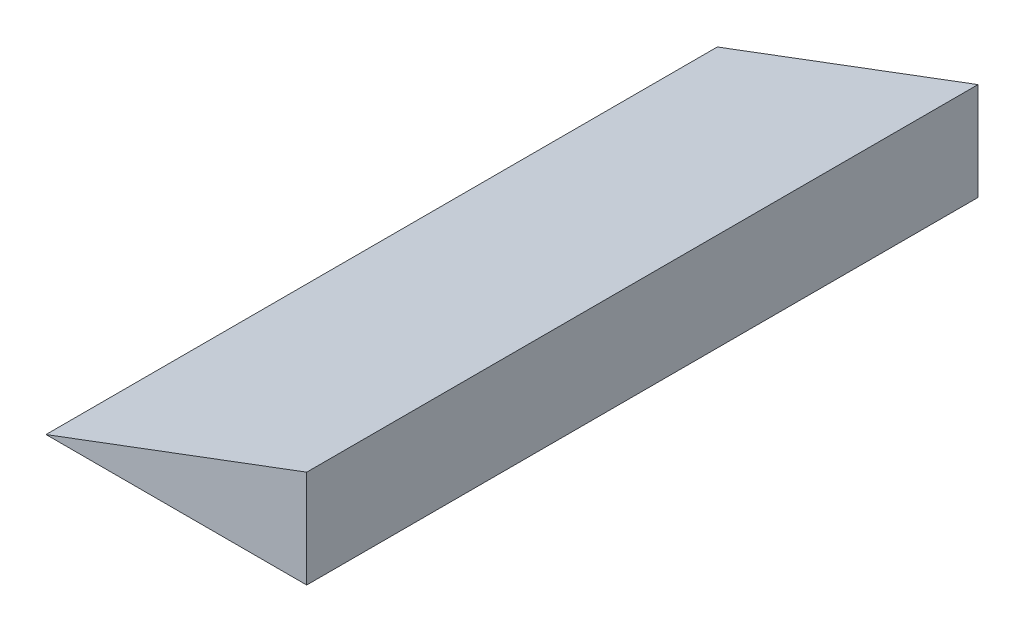
ISO-10303-21;
HEADER;
FILE_DESCRIPTION(('STEP AP214'),'2;1');
FILE_NAME('part.step','',(''),(''),'','','');
FILE_SCHEMA(('AUTOMOTIVE_DESIGN { 1 0 10303 214 1 1 1 1 }'));
ENDSEC;
DATA;
#1=APPLICATION_CONTEXT('core data for automotive mechanical design processes');
#2=APPLICATION_PROTOCOL_DEFINITION('international standard','automotive_design',2000,#1);
#3=PRODUCT_CONTEXT('',#1,'mechanical');
#4=PRODUCT('Part','Part','',(#3));
#5=PRODUCT_RELATED_PRODUCT_CATEGORY('part','',(#4));
#6=PRODUCT_DEFINITION_FORMATION('','',#4);
#7=PRODUCT_DEFINITION_CONTEXT('part definition',#1,'design');
#8=PRODUCT_DEFINITION('design','',#6,#7);
#9=PRODUCT_DEFINITION_SHAPE('','',#8);
#10=(LENGTH_UNIT() NAMED_UNIT(*) SI_UNIT(.MILLI.,.METRE.));
#11=(NAMED_UNIT(*) PLANE_ANGLE_UNIT() SI_UNIT($,.RADIAN.));
#12=(NAMED_UNIT(*) SI_UNIT($,.STERADIAN.) SOLID_ANGLE_UNIT());
#13=UNCERTAINTY_MEASURE_WITH_UNIT(LENGTH_MEASURE(1.E-05),#10,'distance_accuracy_value','');
#14=(GEOMETRIC_REPRESENTATION_CONTEXT(3) GLOBAL_UNCERTAINTY_ASSIGNED_CONTEXT((#13)) GLOBAL_UNIT_ASSIGNED_CONTEXT((#10,
#11,#12)) REPRESENTATION_CONTEXT('',''));
#15=CARTESIAN_POINT('',(0.,0.,0.));
#16=DIRECTION('',(0.,0.,1.));
#17=DIRECTION('',(1.,0.,0.));
#18=AXIS2_PLACEMENT_3D('',#15,#16,#17);
#19=CARTESIAN_POINT('',(12.,0.,103.));
#20=DIRECTION('',(-1.,0.,0.));
#21=DIRECTION('',(0.,-1.,0.));
#22=AXIS2_PLACEMENT_3D('',#19,#20,#21);
#23=PLANE('',#22);
#24=DIRECTION('',(0.,1.,0.));
#25=VECTOR('',#24,1.);
#26=CARTESIAN_POINT('',(12.,0.,0.));
#27=LINE('',#26,#25);
#28=CARTESIAN_POINT('',(12.,0.,0.));
#29=VERTEX_POINT('',#28);
#30=CARTESIAN_POINT('',(12.,15.,0.));
#31=VERTEX_POINT('',#30);
#32=EDGE_CURVE('E88',#29,#31,#27,.T.);
#33=ORIENTED_EDGE('',*,*,#32,.T.);
#34=DIRECTION('',(0.,0.,-1.));
#35=VECTOR('',#34,1.);
#36=CARTESIAN_POINT('',(12.,15.,103.));
#37=LINE('',#36,#35);
#38=CARTESIAN_POINT('',(12.,15.,103.));
#39=VERTEX_POINT('',#38);
#40=EDGE_CURVE('E11',#39,#31,#37,.T.);
#41=ORIENTED_EDGE('',*,*,#40,.F.);
#42=DIRECTION('',(0.,1.,0.));
#43=VECTOR('',#42,1.);
#44=CARTESIAN_POINT('',(12.,0.,103.));
#45=LINE('',#44,#43);
#46=CARTESIAN_POINT('',(12.,0.,103.));
#47=VERTEX_POINT('',#46);
#48=EDGE_CURVE('E81',#47,#39,#45,.T.);
#49=ORIENTED_EDGE('',*,*,#48,.F.);
#50=DIRECTION('',(0.,0.,-1.));
#51=VECTOR('',#50,1.);
#52=CARTESIAN_POINT('',(12.,0.,103.));
#53=LINE('',#52,#51);
#54=EDGE_CURVE('E89',#47,#29,#53,.T.);
#55=ORIENTED_EDGE('',*,*,#54,.T.);
#56=EDGE_LOOP('',(#33,#41,#49,#55));
#57=FACE_BOUND('',#56,.T.);
#58=ADVANCED_FACE('F41',(#57),#23,.F.);
#59=CARTESIAN_POINT('',(12.,15.,103.));
#60=DIRECTION('',(0.351123441588392,-0.936329177569044,0.));
#61=DIRECTION('',(0.936329177569045,0.351123441588392,0.));
#62=AXIS2_PLACEMENT_3D('',#59,#60,#61);
#63=PLANE('',#62);
#64=DIRECTION('',(-0.936329177569044,-0.351123441588392,0.));
#65=VECTOR('',#64,1.);
#66=CARTESIAN_POINT('',(12.,15.,0.));
#67=LINE('',#66,#65);
#68=CARTESIAN_POINT('',(-28.,0.,0.));
#69=VERTEX_POINT('',#68);
#70=EDGE_CURVE('E69',#31,#69,#67,.T.);
#71=ORIENTED_EDGE('',*,*,#70,.T.);
#72=DIRECTION('',(0.,0.,-1.));
#73=VECTOR('',#72,1.);
#74=CARTESIAN_POINT('',(-28.,0.,103.));
#75=LINE('',#74,#73);
#76=CARTESIAN_POINT('',(-28.,0.,103.));
#77=VERTEX_POINT('',#76);
#78=EDGE_CURVE('E49',#77,#69,#75,.T.);
#79=ORIENTED_EDGE('',*,*,#78,.F.);
#80=DIRECTION('',(-0.936329177569044,-0.351123441588392,0.));
#81=VECTOR('',#80,1.);
#82=CARTESIAN_POINT('',(12.,15.,103.));
#83=LINE('',#82,#81);
#84=EDGE_CURVE('E77',#39,#77,#83,.T.);
#85=ORIENTED_EDGE('',*,*,#84,.F.);
#86=ORIENTED_EDGE('',*,*,#40,.T.);
#87=EDGE_LOOP('',(#71,#79,#85,#86));
#88=FACE_BOUND('',#87,.T.);
#89=ADVANCED_FACE('F78',(#88),#63,.F.);
#90=CARTESIAN_POINT('',(-28.,0.,103.));
#91=DIRECTION('',(0.,1.,0.));
#92=DIRECTION('',(0.,0.,1.));
#93=AXIS2_PLACEMENT_3D('',#90,#91,#92);
#94=PLANE('',#93);
#95=DIRECTION('',(1.,0.,0.));
#96=VECTOR('',#95,1.);
#97=CARTESIAN_POINT('',(-28.,0.,0.));
#98=LINE('',#97,#96);
#99=EDGE_CURVE('E74',#69,#29,#98,.T.);
#100=ORIENTED_EDGE('',*,*,#99,.T.);
#101=ORIENTED_EDGE('',*,*,#54,.F.);
#102=DIRECTION('',(1.,0.,0.));
#103=VECTOR('',#102,1.);
#104=CARTESIAN_POINT('',(-28.,0.,103.));
#105=LINE('',#104,#103);
#106=EDGE_CURVE('E57',#77,#47,#105,.T.);
#107=ORIENTED_EDGE('',*,*,#106,.F.);
#108=ORIENTED_EDGE('',*,*,#78,.T.);
#109=EDGE_LOOP('',(#100,#101,#107,#108));
#110=FACE_BOUND('',#109,.T.);
#111=ADVANCED_FACE('F96',(#110),#94,.F.);
#112=CARTESIAN_POINT('',(0.,0.,103.));
#113=DIRECTION('',(0.,0.,-1.));
#114=DIRECTION('',(-1.,0.,0.));
#115=AXIS2_PLACEMENT_3D('',#112,#113,#114);
#116=PLANE('',#115);
#117=ORIENTED_EDGE('',*,*,#48,.T.);
#118=ORIENTED_EDGE('',*,*,#84,.T.);
#119=ORIENTED_EDGE('',*,*,#106,.T.);
#120=EDGE_LOOP('',(#117,#118,#119));
#121=FACE_BOUND('',#120,.T.);
#122=ADVANCED_FACE('F84',(#121),#116,.F.);
#123=CARTESIAN_POINT('',(0.,0.,0.));
#124=DIRECTION('',(0.,0.,-1.));
#125=DIRECTION('',(-1.,0.,0.));
#126=AXIS2_PLACEMENT_3D('',#123,#124,#125);
#127=PLANE('',#126);
#128=ORIENTED_EDGE('',*,*,#32,.F.);
#129=ORIENTED_EDGE('',*,*,#99,.F.);
#130=ORIENTED_EDGE('',*,*,#70,.F.);
#131=EDGE_LOOP('',(#128,#129,#130));
#132=FACE_BOUND('',#131,.T.);
#133=ADVANCED_FACE('F97',(#132),#127,.T.);
#134=CLOSED_SHELL('',(#58,#89,#111,#122,#133));
#135=MANIFOLD_SOLID_BREP('B2',#134);
#136=ADVANCED_BREP_SHAPE_REPRESENTATION('',(#18,#135),#14);
#137=SHAPE_DEFINITION_REPRESENTATION(#9,#136);
ENDSEC;
END-ISO-10303-21;
